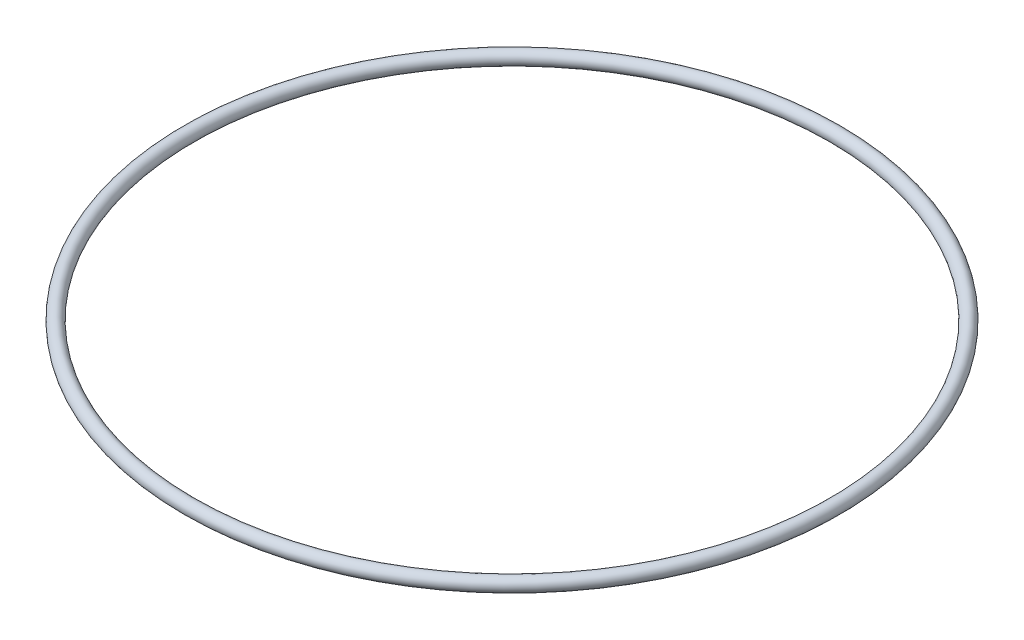
ISO-10303-21;
HEADER;
FILE_DESCRIPTION(('STEP AP214'),'2;1');
FILE_NAME('part.step','',(''),(''),'','','');
FILE_SCHEMA(('AUTOMOTIVE_DESIGN { 1 0 10303 214 1 1 1 1 }'));
ENDSEC;
DATA;
#1=APPLICATION_CONTEXT('core data for automotive mechanical design processes');
#2=APPLICATION_PROTOCOL_DEFINITION('international standard','automotive_design',2000,#1);
#3=PRODUCT_CONTEXT('',#1,'mechanical');
#4=PRODUCT('Part','Part','',(#3));
#5=PRODUCT_RELATED_PRODUCT_CATEGORY('part','',(#4));
#6=PRODUCT_DEFINITION_FORMATION('','',#4);
#7=PRODUCT_DEFINITION_CONTEXT('part definition',#1,'design');
#8=PRODUCT_DEFINITION('design','',#6,#7);
#9=PRODUCT_DEFINITION_SHAPE('','',#8);
#10=(LENGTH_UNIT() NAMED_UNIT(*) SI_UNIT(.MILLI.,.METRE.));
#11=(NAMED_UNIT(*) PLANE_ANGLE_UNIT() SI_UNIT($,.RADIAN.));
#12=(NAMED_UNIT(*) SI_UNIT($,.STERADIAN.) SOLID_ANGLE_UNIT());
#13=UNCERTAINTY_MEASURE_WITH_UNIT(LENGTH_MEASURE(1.E-05),#10,'distance_accuracy_value','');
#14=(GEOMETRIC_REPRESENTATION_CONTEXT(3) GLOBAL_UNCERTAINTY_ASSIGNED_CONTEXT((#13)) GLOBAL_UNIT_ASSIGNED_CONTEXT((#10,
#11,#12)) REPRESENTATION_CONTEXT('',''));
#15=CARTESIAN_POINT('',(0.,0.,0.));
#16=DIRECTION('',(0.,0.,1.));
#17=DIRECTION('',(1.,0.,0.));
#18=AXIS2_PLACEMENT_3D('',#15,#16,#17);
#19=CARTESIAN_POINT('',(59.5,0.,0.));
#20=DIRECTION('',(0.,-1.,0.));
#21=DIRECTION('',(0.,0.,-1.));
#22=AXIS2_PLACEMENT_3D('',#19,#20,#21);
#23=TOROIDAL_SURFACE('',#22,59.5,1.25);
#24=CARTESIAN_POINT('',(59.5,0.,-60.75));
#25=VERTEX_POINT('',#24);
#26=VERTEX_LOOP('',#25);
#27=FACE_BOUND('',#26,.T.);
#28=ADVANCED_FACE('F40',(#27),#23,.T.);
#29=CLOSED_SHELL('',(#28));
#30=CARTESIAN_POINT('',(59.5,0.,0.));
#31=DIRECTION('',(0.,-1.,0.));
#32=DIRECTION('',(0.,0.,-1.));
#33=AXIS2_PLACEMENT_3D('',#30,#31,#32);
#34=TOROIDAL_SURFACE('',#33,59.5,0.64545157683985);
#35=CARTESIAN_POINT('',(59.5,0.,-60.1454515768398));
#36=VERTEX_POINT('',#35);
#37=VERTEX_LOOP('',#36);
#38=FACE_BOUND('',#37,.T.);
#39=ADVANCED_FACE('F53',(#38),#34,.F.);
#40=CLOSED_SHELL('',(#39));
#41=ORIENTED_CLOSED_SHELL('',*,#40,.T.);
#42=BREP_WITH_VOIDS('B2',#29,(#41));
#43=ADVANCED_BREP_SHAPE_REPRESENTATION('',(#18,#42),#14);
#44=SHAPE_DEFINITION_REPRESENTATION(#9,#43);
ENDSEC;
END-ISO-10303-21;
